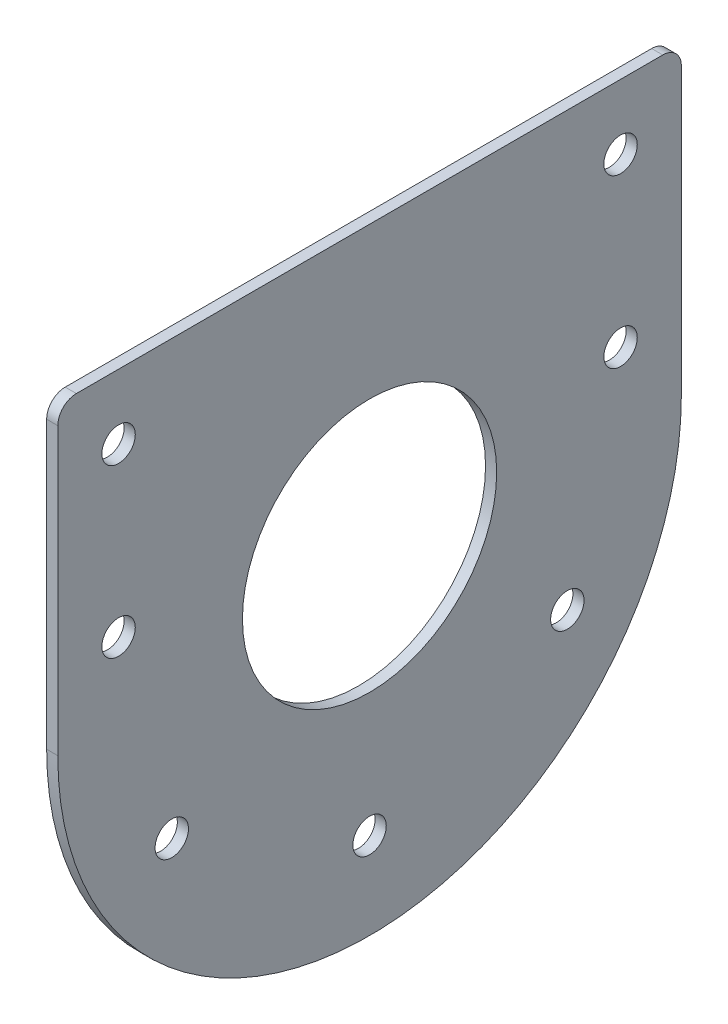
ISO-10303-21;
HEADER;
FILE_DESCRIPTION(('STEP AP214'),'2;1');
FILE_NAME('part.step','',(''),(''),'','','');
FILE_SCHEMA(('AUTOMOTIVE_DESIGN { 1 0 10303 214 1 1 1 1 }'));
ENDSEC;
DATA;
#1=APPLICATION_CONTEXT('core data for automotive mechanical design processes');
#2=APPLICATION_PROTOCOL_DEFINITION('international standard','automotive_design',2000,#1);
#3=PRODUCT_CONTEXT('',#1,'mechanical');
#4=PRODUCT('Part','Part','',(#3));
#5=PRODUCT_RELATED_PRODUCT_CATEGORY('part','',(#4));
#6=PRODUCT_DEFINITION_FORMATION('','',#4);
#7=PRODUCT_DEFINITION_CONTEXT('part definition',#1,'design');
#8=PRODUCT_DEFINITION('design','',#6,#7);
#9=PRODUCT_DEFINITION_SHAPE('','',#8);
#10=(LENGTH_UNIT() NAMED_UNIT(*) SI_UNIT(.MILLI.,.METRE.));
#11=(NAMED_UNIT(*) PLANE_ANGLE_UNIT() SI_UNIT($,.RADIAN.));
#12=(NAMED_UNIT(*) SI_UNIT($,.STERADIAN.) SOLID_ANGLE_UNIT());
#13=UNCERTAINTY_MEASURE_WITH_UNIT(LENGTH_MEASURE(1.E-05),#10,'distance_accuracy_value','');
#14=(GEOMETRIC_REPRESENTATION_CONTEXT(3) GLOBAL_UNCERTAINTY_ASSIGNED_CONTEXT((#13)) GLOBAL_UNIT_ASSIGNED_CONTEXT((#10,
#11,#12)) REPRESENTATION_CONTEXT('',''));
#15=CARTESIAN_POINT('',(0.,0.,0.));
#16=DIRECTION('',(0.,0.,1.));
#17=DIRECTION('',(1.,0.,0.));
#18=AXIS2_PLACEMENT_3D('',#15,#16,#17);
#19=CARTESIAN_POINT('',(-3.,150.,168.));
#20=DIRECTION('',(0.,1.,0.));
#21=DIRECTION('',(0.,0.,1.));
#22=AXIS2_PLACEMENT_3D('',#19,#20,#21);
#23=PLANE('',#22);
#24=DIRECTION('',(0.,0.,1.));
#25=VECTOR('',#24,1.);
#26=CARTESIAN_POINT('',(3.,150.,168.));
#27=LINE('',#26,#25);
#28=CARTESIAN_POINT('',(3.,150.,-158.));
#29=VERTEX_POINT('',#28);
#30=CARTESIAN_POINT('',(3.,150.,158.));
#31=VERTEX_POINT('',#30);
#32=EDGE_CURVE('E130',#29,#31,#27,.T.);
#33=ORIENTED_EDGE('',*,*,#32,.F.);
#34=DIRECTION('',(1.,0.,0.));
#35=VECTOR('',#34,1.);
#36=CARTESIAN_POINT('',(-3.,150.,-158.));
#37=LINE('',#36,#35);
#38=CARTESIAN_POINT('',(-3.,150.,-158.));
#39=VERTEX_POINT('',#38);
#40=EDGE_CURVE('E160',#29,#39,#37,.F.);
#41=ORIENTED_EDGE('',*,*,#40,.T.);
#42=DIRECTION('',(0.,0.,1.));
#43=VECTOR('',#42,1.);
#44=CARTESIAN_POINT('',(-3.,150.,168.));
#45=LINE('',#44,#43);
#46=CARTESIAN_POINT('',(-3.,150.,158.));
#47=VERTEX_POINT('',#46);
#48=EDGE_CURVE('E109',#39,#47,#45,.T.);
#49=ORIENTED_EDGE('',*,*,#48,.T.);
#50=DIRECTION('',(1.,0.,0.));
#51=VECTOR('',#50,1.);
#52=CARTESIAN_POINT('',(-3.,150.,158.));
#53=LINE('',#52,#51);
#54=EDGE_CURVE('E156',#47,#31,#53,.T.);
#55=ORIENTED_EDGE('',*,*,#54,.T.);
#56=EDGE_LOOP('',(#33,#41,#49,#55));
#57=FACE_BOUND('',#56,.T.);
#58=ADVANCED_FACE('F49',(#57),#23,.T.);
#59=CARTESIAN_POINT('',(-3.,150.,-168.));
#60=DIRECTION('',(0.,0.,-1.));
#61=DIRECTION('',(-1.,0.,0.));
#62=AXIS2_PLACEMENT_3D('',#59,#60,#61);
#63=PLANE('',#62);
#64=DIRECTION('',(0.,1.,0.));
#65=VECTOR('',#64,1.);
#66=CARTESIAN_POINT('',(-3.,150.,-168.));
#67=LINE('',#66,#65);
#68=CARTESIAN_POINT('',(-3.,-14.0000000000001,-168.));
#69=VERTEX_POINT('',#68);
#70=CARTESIAN_POINT('',(-3.,140.,-168.));
#71=VERTEX_POINT('',#70);
#72=EDGE_CURVE('E119',#69,#71,#67,.T.);
#73=ORIENTED_EDGE('',*,*,#72,.T.);
#74=DIRECTION('',(1.,0.,0.));
#75=VECTOR('',#74,1.);
#76=CARTESIAN_POINT('',(-3.,140.,-168.));
#77=LINE('',#76,#75);
#78=CARTESIAN_POINT('',(3.,140.,-168.));
#79=VERTEX_POINT('',#78);
#80=EDGE_CURVE('E145',#71,#79,#77,.T.);
#81=ORIENTED_EDGE('',*,*,#80,.T.);
#82=DIRECTION('',(0.,1.,0.));
#83=VECTOR('',#82,1.);
#84=CARTESIAN_POINT('',(3.,150.,-168.));
#85=LINE('',#84,#83);
#86=CARTESIAN_POINT('',(3.,-14.0000000000001,-168.));
#87=VERTEX_POINT('',#86);
#88=EDGE_CURVE('E140',#87,#79,#85,.T.);
#89=ORIENTED_EDGE('',*,*,#88,.F.);
#90=DIRECTION('',(1.,0.,0.));
#91=VECTOR('',#90,1.);
#92=CARTESIAN_POINT('',(-3.,-14.0000000000001,-168.));
#93=LINE('',#92,#91);
#94=EDGE_CURVE('E118',#69,#87,#93,.T.);
#95=ORIENTED_EDGE('',*,*,#94,.F.);
#96=EDGE_LOOP('',(#73,#81,#89,#95));
#97=FACE_BOUND('',#96,.T.);
#98=ADVANCED_FACE('F171',(#97),#63,.T.);
#99=CARTESIAN_POINT('',(-3.,-14.0000000000001,0.));
#100=DIRECTION('',(1.,0.,0.));
#101=DIRECTION('',(0.,0.,-1.));
#102=AXIS2_PLACEMENT_3D('',#99,#100,#101);
#103=CYLINDRICAL_SURFACE('',#102,168.);
#104=CARTESIAN_POINT('',(3.,-14.0000000000001,0.));
#105=DIRECTION('',(1.,0.,0.));
#106=DIRECTION('',(0.,0.,-1.));
#107=AXIS2_PLACEMENT_3D('',#104,#105,#106);
#108=CIRCLE('',#107,168.);
#109=CARTESIAN_POINT('',(3.,-14.0000000000001,168.));
#110=VERTEX_POINT('',#109);
#111=EDGE_CURVE('E116',#110,#87,#108,.T.);
#112=ORIENTED_EDGE('',*,*,#111,.F.);
#113=DIRECTION('',(1.,0.,0.));
#114=VECTOR('',#113,1.);
#115=CARTESIAN_POINT('',(-3.,-14.0000000000001,168.));
#116=LINE('',#115,#114);
#117=CARTESIAN_POINT('',(-3.,-14.0000000000001,168.));
#118=VERTEX_POINT('',#117);
#119=EDGE_CURVE('E104',#118,#110,#116,.T.);
#120=ORIENTED_EDGE('',*,*,#119,.F.);
#121=CARTESIAN_POINT('',(-3.,-14.0000000000001,0.));
#122=DIRECTION('',(1.,0.,0.));
#123=DIRECTION('',(0.,0.,-1.));
#124=AXIS2_PLACEMENT_3D('',#121,#122,#123);
#125=CIRCLE('',#124,168.);
#126=EDGE_CURVE('E108',#118,#69,#125,.T.);
#127=ORIENTED_EDGE('',*,*,#126,.T.);
#128=ORIENTED_EDGE('',*,*,#94,.T.);
#129=EDGE_LOOP('',(#112,#120,#127,#128));
#130=FACE_BOUND('',#129,.T.);
#131=ADVANCED_FACE('F113',(#130),#103,.T.);
#132=CARTESIAN_POINT('',(-3.,150.,168.));
#133=DIRECTION('',(0.,0.,1.));
#134=DIRECTION('',(1.,0.,0.));
#135=AXIS2_PLACEMENT_3D('',#132,#133,#134);
#136=PLANE('',#135);
#137=DIRECTION('',(0.,-1.,0.));
#138=VECTOR('',#137,1.);
#139=CARTESIAN_POINT('',(3.,150.,168.));
#140=LINE('',#139,#138);
#141=CARTESIAN_POINT('',(3.,140.,168.));
#142=VERTEX_POINT('',#141);
#143=EDGE_CURVE('E134',#142,#110,#140,.T.);
#144=ORIENTED_EDGE('',*,*,#143,.F.);
#145=DIRECTION('',(1.,0.,0.));
#146=VECTOR('',#145,1.);
#147=CARTESIAN_POINT('',(-3.,140.,168.));
#148=LINE('',#147,#146);
#149=CARTESIAN_POINT('',(-3.,140.,168.));
#150=VERTEX_POINT('',#149);
#151=EDGE_CURVE('E11',#142,#150,#148,.F.);
#152=ORIENTED_EDGE('',*,*,#151,.T.);
#153=DIRECTION('',(0.,-1.,0.));
#154=VECTOR('',#153,1.);
#155=CARTESIAN_POINT('',(-3.,150.,168.));
#156=LINE('',#155,#154);
#157=EDGE_CURVE('E101',#150,#118,#156,.T.);
#158=ORIENTED_EDGE('',*,*,#157,.T.);
#159=ORIENTED_EDGE('',*,*,#119,.T.);
#160=EDGE_LOOP('',(#144,#152,#158,#159));
#161=FACE_BOUND('',#160,.T.);
#162=ADVANCED_FACE('F103',(#161),#136,.T.);
#163=CARTESIAN_POINT('',(-3.,-14.0000000000001,0.));
#164=DIRECTION('',(1.,0.,0.));
#165=DIRECTION('',(0.,0.,-1.));
#166=AXIS2_PLACEMENT_3D('',#163,#164,#165);
#167=PLANE('',#166);
#168=CARTESIAN_POINT('',(-3.,-83.2682145377947,-106.57845442531));
#169=DIRECTION('',(1.,0.,0.));
#170=DIRECTION('',(0.,0.,-1.));
#171=AXIS2_PLACEMENT_3D('',#168,#169,#170);
#172=CIRCLE('',#171,8.99999999999999);
#173=CARTESIAN_POINT('',(-3.,-83.2682145377947,-115.57845442531));
#174=VERTEX_POINT('',#173);
#175=EDGE_CURVE('E289',#174,#174,#172,.T.);
#176=ORIENTED_EDGE('',*,*,#175,.T.);
#177=EDGE_LOOP('',(#176));
#178=FACE_BOUND('',#177,.T.);
#179=CARTESIAN_POINT('',(-3.,115.,-135.25));
#180=DIRECTION('',(1.,0.,0.));
#181=DIRECTION('',(0.,0.,-1.));
#182=AXIS2_PLACEMENT_3D('',#179,#180,#181);
#183=CIRCLE('',#182,9.00000000000001);
#184=CARTESIAN_POINT('',(-3.,115.,-144.25));
#185=VERTEX_POINT('',#184);
#186=EDGE_CURVE('E281',#185,#185,#183,.T.);
#187=ORIENTED_EDGE('',*,*,#186,.T.);
#188=EDGE_LOOP('',(#187));
#189=FACE_BOUND('',#188,.T.);
#190=CARTESIAN_POINT('',(-3.,25.,-135.25));
#191=DIRECTION('',(1.,0.,0.));
#192=DIRECTION('',(0.,0.,-1.));
#193=AXIS2_PLACEMENT_3D('',#190,#191,#192);
#194=CIRCLE('',#193,9.00000000000001);
#195=CARTESIAN_POINT('',(-3.,25.,-144.25));
#196=VERTEX_POINT('',#195);
#197=EDGE_CURVE('E282',#196,#196,#194,.T.);
#198=ORIENTED_EDGE('',*,*,#197,.T.);
#199=EDGE_LOOP('',(#198));
#200=FACE_BOUND('',#199,.T.);
#201=CARTESIAN_POINT('',(-3.,-83.2682145377947,106.57845442531));
#202=DIRECTION('',(1.,0.,0.));
#203=DIRECTION('',(0.,0.,-1.));
#204=AXIS2_PLACEMENT_3D('',#201,#202,#203);
#205=CIRCLE('',#204,8.99999999999999);
#206=CARTESIAN_POINT('',(-3.,-83.2682145377947,97.5784544253096));
#207=VERTEX_POINT('',#206);
#208=EDGE_CURVE('E272',#207,#207,#205,.T.);
#209=ORIENTED_EDGE('',*,*,#208,.T.);
#210=EDGE_LOOP('',(#209));
#211=FACE_BOUND('',#210,.T.);
#212=CARTESIAN_POINT('',(-3.,-135.25,0.));
#213=DIRECTION('',(1.,0.,0.));
#214=DIRECTION('',(0.,0.,-1.));
#215=AXIS2_PLACEMENT_3D('',#212,#213,#214);
#216=CIRCLE('',#215,9.00000000000001);
#217=CARTESIAN_POINT('',(-3.,-135.25,-9.00000000000001));
#218=VERTEX_POINT('',#217);
#219=EDGE_CURVE('E264',#218,#218,#216,.T.);
#220=ORIENTED_EDGE('',*,*,#219,.T.);
#221=EDGE_LOOP('',(#220));
#222=FACE_BOUND('',#221,.T.);
#223=CARTESIAN_POINT('',(-3.,115.,135.25));
#224=DIRECTION('',(1.,0.,0.));
#225=DIRECTION('',(0.,0.,-1.));
#226=AXIS2_PLACEMENT_3D('',#223,#224,#225);
#227=CIRCLE('',#226,9.00000000000001);
#228=CARTESIAN_POINT('',(-3.,115.,126.25));
#229=VERTEX_POINT('',#228);
#230=EDGE_CURVE('E256',#229,#229,#227,.T.);
#231=ORIENTED_EDGE('',*,*,#230,.T.);
#232=EDGE_LOOP('',(#231));
#233=FACE_BOUND('',#232,.T.);
#234=CARTESIAN_POINT('',(-3.,0.,0.));
#235=DIRECTION('',(1.,0.,0.));
#236=DIRECTION('',(0.,0.,-1.));
#237=AXIS2_PLACEMENT_3D('',#234,#235,#236);
#238=CIRCLE('',#237,68.5);
#239=CARTESIAN_POINT('',(-3.,0.,-68.5));
#240=VERTEX_POINT('',#239);
#241=EDGE_CURVE('E237',#240,#240,#238,.T.);
#242=ORIENTED_EDGE('',*,*,#241,.T.);
#243=EDGE_LOOP('',(#242));
#244=FACE_BOUND('',#243,.T.);
#245=CARTESIAN_POINT('',(-3.,25.,135.25));
#246=DIRECTION('',(1.,0.,0.));
#247=DIRECTION('',(0.,0.,-1.));
#248=AXIS2_PLACEMENT_3D('',#245,#246,#247);
#249=CIRCLE('',#248,9.00000000000001);
#250=CARTESIAN_POINT('',(-3.,25.,126.25));
#251=VERTEX_POINT('',#250);
#252=EDGE_CURVE('E135',#251,#251,#249,.T.);
#253=ORIENTED_EDGE('',*,*,#252,.T.);
#254=EDGE_LOOP('',(#253));
#255=FACE_BOUND('',#254,.T.);
#256=ORIENTED_EDGE('',*,*,#48,.F.);
#257=CARTESIAN_POINT('',(-3.,140.,-158.));
#258=DIRECTION('',(1.,0.,0.));
#259=DIRECTION('',(0.,0.,-1.));
#260=AXIS2_PLACEMENT_3D('',#257,#258,#259);
#261=CIRCLE('',#260,10.);
#262=EDGE_CURVE('E58',#39,#71,#261,.F.);
#263=ORIENTED_EDGE('',*,*,#262,.T.);
#264=ORIENTED_EDGE('',*,*,#72,.F.);
#265=ORIENTED_EDGE('',*,*,#126,.F.);
#266=ORIENTED_EDGE('',*,*,#157,.F.);
#267=CARTESIAN_POINT('',(-3.,140.,158.));
#268=DIRECTION('',(1.,0.,0.));
#269=DIRECTION('',(0.,0.,-1.));
#270=AXIS2_PLACEMENT_3D('',#267,#268,#269);
#271=CIRCLE('',#270,10.);
#272=EDGE_CURVE('E70',#150,#47,#271,.F.);
#273=ORIENTED_EDGE('',*,*,#272,.T.);
#274=EDGE_LOOP('',(#256,#263,#264,#265,#266,#273));
#275=FACE_BOUND('',#274,.T.);
#276=ADVANCED_FACE('F121',(#178,#189,#200,#211,#222,#233,#244,#255,#275),#167,.F.);
#277=CARTESIAN_POINT('',(3.,-14.0000000000001,0.));
#278=DIRECTION('',(1.,0.,0.));
#279=DIRECTION('',(0.,0.,-1.));
#280=AXIS2_PLACEMENT_3D('',#277,#278,#279);
#281=PLANE('',#280);
#282=CARTESIAN_POINT('',(3.,-83.2682145377947,-106.57845442531));
#283=DIRECTION('',(1.,0.,0.));
#284=DIRECTION('',(0.,0.,-1.));
#285=AXIS2_PLACEMENT_3D('',#282,#283,#284);
#286=CIRCLE('',#285,8.99999999999999);
#287=CARTESIAN_POINT('',(3.,-83.2682145377947,-115.57845442531));
#288=VERTEX_POINT('',#287);
#289=EDGE_CURVE('E276',#288,#288,#286,.T.);
#290=ORIENTED_EDGE('',*,*,#289,.F.);
#291=EDGE_LOOP('',(#290));
#292=FACE_BOUND('',#291,.T.);
#293=CARTESIAN_POINT('',(3.,115.,-135.25));
#294=DIRECTION('',(1.,0.,0.));
#295=DIRECTION('',(0.,0.,-1.));
#296=AXIS2_PLACEMENT_3D('',#293,#294,#295);
#297=CIRCLE('',#296,9.00000000000001);
#298=CARTESIAN_POINT('',(3.,115.,-144.25));
#299=VERTEX_POINT('',#298);
#300=EDGE_CURVE('E293',#299,#299,#297,.T.);
#301=ORIENTED_EDGE('',*,*,#300,.F.);
#302=EDGE_LOOP('',(#301));
#303=FACE_BOUND('',#302,.T.);
#304=CARTESIAN_POINT('',(3.,25.,-135.25));
#305=DIRECTION('',(1.,0.,0.));
#306=DIRECTION('',(0.,0.,-1.));
#307=AXIS2_PLACEMENT_3D('',#304,#305,#306);
#308=CIRCLE('',#307,9.00000000000001);
#309=CARTESIAN_POINT('',(3.,25.,-144.25));
#310=VERTEX_POINT('',#309);
#311=EDGE_CURVE('E277',#310,#310,#308,.T.);
#312=ORIENTED_EDGE('',*,*,#311,.F.);
#313=EDGE_LOOP('',(#312));
#314=FACE_BOUND('',#313,.T.);
#315=CARTESIAN_POINT('',(3.,-83.2682145377947,106.57845442531));
#316=DIRECTION('',(1.,0.,0.));
#317=DIRECTION('',(0.,0.,-1.));
#318=AXIS2_PLACEMENT_3D('',#315,#316,#317);
#319=CIRCLE('',#318,8.99999999999999);
#320=CARTESIAN_POINT('',(3.,-83.2682145377947,97.5784544253096));
#321=VERTEX_POINT('',#320);
#322=EDGE_CURVE('E268',#321,#321,#319,.T.);
#323=ORIENTED_EDGE('',*,*,#322,.F.);
#324=EDGE_LOOP('',(#323));
#325=FACE_BOUND('',#324,.T.);
#326=CARTESIAN_POINT('',(3.,-135.25,0.));
#327=DIRECTION('',(1.,0.,0.));
#328=DIRECTION('',(0.,0.,-1.));
#329=AXIS2_PLACEMENT_3D('',#326,#327,#328);
#330=CIRCLE('',#329,9.00000000000001);
#331=CARTESIAN_POINT('',(3.,-135.25,-9.00000000000001));
#332=VERTEX_POINT('',#331);
#333=EDGE_CURVE('E260',#332,#332,#330,.T.);
#334=ORIENTED_EDGE('',*,*,#333,.F.);
#335=EDGE_LOOP('',(#334));
#336=FACE_BOUND('',#335,.T.);
#337=CARTESIAN_POINT('',(3.,115.,135.25));
#338=DIRECTION('',(1.,0.,0.));
#339=DIRECTION('',(0.,0.,-1.));
#340=AXIS2_PLACEMENT_3D('',#337,#338,#339);
#341=CIRCLE('',#340,9.00000000000001);
#342=CARTESIAN_POINT('',(3.,115.,126.25));
#343=VERTEX_POINT('',#342);
#344=EDGE_CURVE('E250',#343,#343,#341,.T.);
#345=ORIENTED_EDGE('',*,*,#344,.F.);
#346=EDGE_LOOP('',(#345));
#347=FACE_BOUND('',#346,.T.);
#348=CARTESIAN_POINT('',(3.,0.,0.));
#349=DIRECTION('',(1.,0.,0.));
#350=DIRECTION('',(0.,0.,-1.));
#351=AXIS2_PLACEMENT_3D('',#348,#349,#350);
#352=CIRCLE('',#351,68.5);
#353=CARTESIAN_POINT('',(3.,0.,-68.5));
#354=VERTEX_POINT('',#353);
#355=EDGE_CURVE('E240',#354,#354,#352,.T.);
#356=ORIENTED_EDGE('',*,*,#355,.F.);
#357=EDGE_LOOP('',(#356));
#358=FACE_BOUND('',#357,.T.);
#359=CARTESIAN_POINT('',(3.,25.,135.25));
#360=DIRECTION('',(1.,0.,0.));
#361=DIRECTION('',(0.,0.,-1.));
#362=AXIS2_PLACEMENT_3D('',#359,#360,#361);
#363=CIRCLE('',#362,9.00000000000001);
#364=CARTESIAN_POINT('',(3.,25.,126.25));
#365=VERTEX_POINT('',#364);
#366=EDGE_CURVE('E243',#365,#365,#363,.T.);
#367=ORIENTED_EDGE('',*,*,#366,.F.);
#368=EDGE_LOOP('',(#367));
#369=FACE_BOUND('',#368,.T.);
#370=ORIENTED_EDGE('',*,*,#88,.T.);
#371=CARTESIAN_POINT('',(3.,140.,-158.));
#372=DIRECTION('',(1.,0.,0.));
#373=DIRECTION('',(0.,0.,-1.));
#374=AXIS2_PLACEMENT_3D('',#371,#372,#373);
#375=CIRCLE('',#374,10.);
#376=EDGE_CURVE('E153',#79,#29,#375,.T.);
#377=ORIENTED_EDGE('',*,*,#376,.T.);
#378=ORIENTED_EDGE('',*,*,#32,.T.);
#379=CARTESIAN_POINT('',(3.,140.,158.));
#380=DIRECTION('',(1.,0.,0.));
#381=DIRECTION('',(0.,0.,-1.));
#382=AXIS2_PLACEMENT_3D('',#379,#380,#381);
#383=CIRCLE('',#382,10.);
#384=EDGE_CURVE('E150',#31,#142,#383,.T.);
#385=ORIENTED_EDGE('',*,*,#384,.T.);
#386=ORIENTED_EDGE('',*,*,#143,.T.);
#387=ORIENTED_EDGE('',*,*,#111,.T.);
#388=EDGE_LOOP('',(#370,#377,#378,#385,#386,#387));
#389=FACE_BOUND('',#388,.T.);
#390=ADVANCED_FACE('F176',(#292,#303,#314,#325,#336,#347,#358,#369,#389),#281,.T.);
#391=CARTESIAN_POINT('',(-3.,25.,135.25));
#392=DIRECTION('',(1.,0.,0.));
#393=DIRECTION('',(0.,0.,-1.));
#394=AXIS2_PLACEMENT_3D('',#391,#392,#393);
#395=CYLINDRICAL_SURFACE('',#394,9.00000000000001);
#396=ORIENTED_EDGE('',*,*,#252,.F.);
#397=EDGE_LOOP('',(#396));
#398=FACE_BOUND('',#397,.T.);
#399=ORIENTED_EDGE('',*,*,#366,.T.);
#400=EDGE_LOOP('',(#399));
#401=FACE_BOUND('',#400,.T.);
#402=ADVANCED_FACE('F199',(#398,#401),#395,.F.);
#403=CARTESIAN_POINT('',(-3.,0.,0.));
#404=DIRECTION('',(1.,0.,0.));
#405=DIRECTION('',(0.,0.,-1.));
#406=AXIS2_PLACEMENT_3D('',#403,#404,#405);
#407=CYLINDRICAL_SURFACE('',#406,68.5);
#408=ORIENTED_EDGE('',*,*,#241,.F.);
#409=EDGE_LOOP('',(#408));
#410=FACE_BOUND('',#409,.T.);
#411=ORIENTED_EDGE('',*,*,#355,.T.);
#412=EDGE_LOOP('',(#411));
#413=FACE_BOUND('',#412,.T.);
#414=ADVANCED_FACE('F206',(#410,#413),#407,.F.);
#415=CARTESIAN_POINT('',(-3.,115.,135.25));
#416=DIRECTION('',(1.,0.,0.));
#417=DIRECTION('',(0.,0.,-1.));
#418=AXIS2_PLACEMENT_3D('',#415,#416,#417);
#419=CYLINDRICAL_SURFACE('',#418,9.00000000000001);
#420=ORIENTED_EDGE('',*,*,#230,.F.);
#421=EDGE_LOOP('',(#420));
#422=FACE_BOUND('',#421,.T.);
#423=ORIENTED_EDGE('',*,*,#344,.T.);
#424=EDGE_LOOP('',(#423));
#425=FACE_BOUND('',#424,.T.);
#426=ADVANCED_FACE('F225',(#422,#425),#419,.F.);
#427=CARTESIAN_POINT('',(-3.,-135.25,0.));
#428=DIRECTION('',(1.,0.,0.));
#429=DIRECTION('',(0.,0.,-1.));
#430=AXIS2_PLACEMENT_3D('',#427,#428,#429);
#431=CYLINDRICAL_SURFACE('',#430,9.00000000000001);
#432=ORIENTED_EDGE('',*,*,#219,.F.);
#433=EDGE_LOOP('',(#432));
#434=FACE_BOUND('',#433,.T.);
#435=ORIENTED_EDGE('',*,*,#333,.T.);
#436=EDGE_LOOP('',(#435));
#437=FACE_BOUND('',#436,.T.);
#438=ADVANCED_FACE('F221',(#434,#437),#431,.F.);
#439=CARTESIAN_POINT('',(-3.,-83.2682145377947,106.57845442531));
#440=DIRECTION('',(1.,0.,0.));
#441=DIRECTION('',(0.,0.,-1.));
#442=AXIS2_PLACEMENT_3D('',#439,#440,#441);
#443=CYLINDRICAL_SURFACE('',#442,8.99999999999999);
#444=ORIENTED_EDGE('',*,*,#208,.F.);
#445=EDGE_LOOP('',(#444));
#446=FACE_BOUND('',#445,.T.);
#447=ORIENTED_EDGE('',*,*,#322,.T.);
#448=EDGE_LOOP('',(#447));
#449=FACE_BOUND('',#448,.T.);
#450=ADVANCED_FACE('F217',(#446,#449),#443,.F.);
#451=CARTESIAN_POINT('',(-3.,25.,-135.25));
#452=DIRECTION('',(1.,0.,0.));
#453=DIRECTION('',(0.,0.,-1.));
#454=AXIS2_PLACEMENT_3D('',#451,#452,#453);
#455=CYLINDRICAL_SURFACE('',#454,9.00000000000001);
#456=ORIENTED_EDGE('',*,*,#197,.F.);
#457=EDGE_LOOP('',(#456));
#458=FACE_BOUND('',#457,.T.);
#459=ORIENTED_EDGE('',*,*,#311,.T.);
#460=EDGE_LOOP('',(#459));
#461=FACE_BOUND('',#460,.T.);
#462=ADVANCED_FACE('F211',(#458,#461),#455,.F.);
#463=CARTESIAN_POINT('',(-3.,115.,-135.25));
#464=DIRECTION('',(1.,0.,0.));
#465=DIRECTION('',(0.,0.,-1.));
#466=AXIS2_PLACEMENT_3D('',#463,#464,#465);
#467=CYLINDRICAL_SURFACE('',#466,9.00000000000001);
#468=ORIENTED_EDGE('',*,*,#186,.F.);
#469=EDGE_LOOP('',(#468));
#470=FACE_BOUND('',#469,.T.);
#471=ORIENTED_EDGE('',*,*,#300,.T.);
#472=EDGE_LOOP('',(#471));
#473=FACE_BOUND('',#472,.T.);
#474=ADVANCED_FACE('F208',(#470,#473),#467,.F.);
#475=CARTESIAN_POINT('',(-3.,-83.2682145377947,-106.57845442531));
#476=DIRECTION('',(1.,0.,0.));
#477=DIRECTION('',(0.,0.,-1.));
#478=AXIS2_PLACEMENT_3D('',#475,#476,#477);
#479=CYLINDRICAL_SURFACE('',#478,8.99999999999999);
#480=ORIENTED_EDGE('',*,*,#175,.F.);
#481=EDGE_LOOP('',(#480));
#482=FACE_BOUND('',#481,.T.);
#483=ORIENTED_EDGE('',*,*,#289,.T.);
#484=EDGE_LOOP('',(#483));
#485=FACE_BOUND('',#484,.T.);
#486=ADVANCED_FACE('F184',(#482,#485),#479,.F.);
#487=CARTESIAN_POINT('',(-3.,140.,-158.));
#488=DIRECTION('',(1.,0.,0.));
#489=DIRECTION('',(0.,0.,-1.));
#490=AXIS2_PLACEMENT_3D('',#487,#488,#489);
#491=CYLINDRICAL_SURFACE('',#490,10.);
#492=ORIENTED_EDGE('',*,*,#262,.F.);
#493=ORIENTED_EDGE('',*,*,#40,.F.);
#494=ORIENTED_EDGE('',*,*,#376,.F.);
#495=ORIENTED_EDGE('',*,*,#80,.F.);
#496=EDGE_LOOP('',(#492,#493,#494,#495));
#497=FACE_BOUND('',#496,.T.);
#498=ADVANCED_FACE('F173',(#497),#491,.T.);
#499=CARTESIAN_POINT('',(-3.,140.,158.));
#500=DIRECTION('',(1.,0.,0.));
#501=DIRECTION('',(0.,0.,-1.));
#502=AXIS2_PLACEMENT_3D('',#499,#500,#501);
#503=CYLINDRICAL_SURFACE('',#502,10.);
#504=ORIENTED_EDGE('',*,*,#272,.F.);
#505=ORIENTED_EDGE('',*,*,#151,.F.);
#506=ORIENTED_EDGE('',*,*,#384,.F.);
#507=ORIENTED_EDGE('',*,*,#54,.F.);
#508=EDGE_LOOP('',(#504,#505,#506,#507));
#509=FACE_BOUND('',#508,.T.);
#510=ADVANCED_FACE('F51',(#509),#503,.T.);
#511=CLOSED_SHELL('',(#58,#98,#131,#162,#276,#390,#402,#414,#426,#438,#450,#462,#474,#486,#498,#510));
#512=MANIFOLD_SOLID_BREP('B2',#511);
#513=ADVANCED_BREP_SHAPE_REPRESENTATION('',(#18,#512),#14);
#514=SHAPE_DEFINITION_REPRESENTATION(#9,#513);
ENDSEC;
END-ISO-10303-21;
